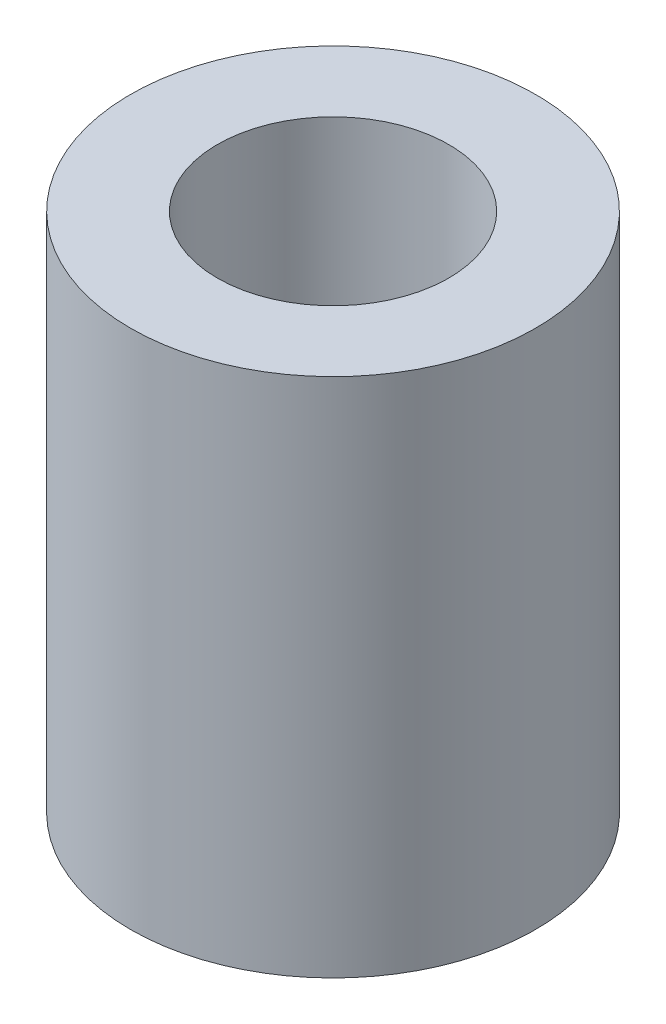
ISO-10303-21;
HEADER;
FILE_DESCRIPTION(('STEP AP214'),'2;1');
FILE_NAME('part.step','',(''),(''),'','','');
FILE_SCHEMA(('AUTOMOTIVE_DESIGN { 1 0 10303 214 1 1 1 1 }'));
ENDSEC;
DATA;
#1=APPLICATION_CONTEXT('core data for automotive mechanical design processes');
#2=APPLICATION_PROTOCOL_DEFINITION('international standard','automotive_design',2000,#1);
#3=PRODUCT_CONTEXT('',#1,'mechanical');
#4=PRODUCT('Part','Part','',(#3));
#5=PRODUCT_RELATED_PRODUCT_CATEGORY('part','',(#4));
#6=PRODUCT_DEFINITION_FORMATION('','',#4);
#7=PRODUCT_DEFINITION_CONTEXT('part definition',#1,'design');
#8=PRODUCT_DEFINITION('design','',#6,#7);
#9=PRODUCT_DEFINITION_SHAPE('','',#8);
#10=(LENGTH_UNIT() NAMED_UNIT(*) SI_UNIT(.MILLI.,.METRE.));
#11=(NAMED_UNIT(*) PLANE_ANGLE_UNIT() SI_UNIT($,.RADIAN.));
#12=(NAMED_UNIT(*) SI_UNIT($,.STERADIAN.) SOLID_ANGLE_UNIT());
#13=UNCERTAINTY_MEASURE_WITH_UNIT(LENGTH_MEASURE(1.E-05),#10,'distance_accuracy_value','');
#14=(GEOMETRIC_REPRESENTATION_CONTEXT(3) GLOBAL_UNCERTAINTY_ASSIGNED_CONTEXT((#13)) GLOBAL_UNIT_ASSIGNED_CONTEXT((#10,
#11,#12)) REPRESENTATION_CONTEXT('',''));
#15=CARTESIAN_POINT('',(0.,0.,0.));
#16=DIRECTION('',(0.,0.,1.));
#17=DIRECTION('',(1.,0.,0.));
#18=AXIS2_PLACEMENT_3D('',#15,#16,#17);
#19=CARTESIAN_POINT('',(0.,11.43,0.));
#20=DIRECTION('',(0.,1.,0.));
#21=DIRECTION('',(0.,0.,1.));
#22=AXIS2_PLACEMENT_3D('',#19,#20,#21);
#23=PLANE('',#22);
#24=CARTESIAN_POINT('',(0.,11.43,0.));
#25=DIRECTION('',(0.,1.,0.));
#26=DIRECTION('',(0.,0.,1.));
#27=AXIS2_PLACEMENT_3D('',#24,#25,#26);
#28=CIRCLE('',#27,4.445);
#29=CARTESIAN_POINT('',(0.,11.43,4.445));
#30=VERTEX_POINT('',#29);
#31=EDGE_CURVE('E10',#30,#30,#28,.T.);
#32=ORIENTED_EDGE('',*,*,#31,.T.);
#33=EDGE_LOOP('',(#32));
#34=FACE_BOUND('',#33,.T.);
#35=CARTESIAN_POINT('',(0.,11.43,0.));
#36=DIRECTION('',(0.,1.,0.));
#37=DIRECTION('',(0.,0.,1.));
#38=AXIS2_PLACEMENT_3D('',#35,#36,#37);
#39=CIRCLE('',#38,2.54);
#40=CARTESIAN_POINT('',(0.,11.43,2.54));
#41=VERTEX_POINT('',#40);
#42=EDGE_CURVE('E41',#41,#41,#39,.T.);
#43=ORIENTED_EDGE('',*,*,#42,.F.);
#44=EDGE_LOOP('',(#43));
#45=FACE_BOUND('',#44,.T.);
#46=ADVANCED_FACE('F30',(#34,#45),#23,.T.);
#47=CARTESIAN_POINT('',(0.,0.,0.));
#48=DIRECTION('',(0.,1.,0.));
#49=DIRECTION('',(0.,0.,1.));
#50=AXIS2_PLACEMENT_3D('',#47,#48,#49);
#51=PLANE('',#50);
#52=CARTESIAN_POINT('',(0.,0.,0.));
#53=DIRECTION('',(0.,1.,0.));
#54=DIRECTION('',(0.,0.,1.));
#55=AXIS2_PLACEMENT_3D('',#52,#53,#54);
#56=CIRCLE('',#55,4.445);
#57=CARTESIAN_POINT('',(0.,0.,4.445));
#58=VERTEX_POINT('',#57);
#59=EDGE_CURVE('E34',#58,#58,#56,.T.);
#60=ORIENTED_EDGE('',*,*,#59,.F.);
#61=EDGE_LOOP('',(#60));
#62=FACE_BOUND('',#61,.T.);
#63=CARTESIAN_POINT('',(0.,0.,0.));
#64=DIRECTION('',(0.,1.,0.));
#65=DIRECTION('',(0.,0.,1.));
#66=AXIS2_PLACEMENT_3D('',#63,#64,#65);
#67=CIRCLE('',#66,2.54);
#68=CARTESIAN_POINT('',(0.,0.,2.54));
#69=VERTEX_POINT('',#68);
#70=EDGE_CURVE('E43',#69,#69,#67,.T.);
#71=ORIENTED_EDGE('',*,*,#70,.T.);
#72=EDGE_LOOP('',(#71));
#73=FACE_BOUND('',#72,.T.);
#74=ADVANCED_FACE('F53',(#62,#73),#51,.F.);
#75=CARTESIAN_POINT('',(0.,11.43,0.));
#76=DIRECTION('',(0.,-1.,0.));
#77=DIRECTION('',(0.,0.,-1.));
#78=AXIS2_PLACEMENT_3D('',#75,#76,#77);
#79=CYLINDRICAL_SURFACE('',#78,4.445);
#80=ORIENTED_EDGE('',*,*,#31,.F.);
#81=EDGE_LOOP('',(#80));
#82=FACE_BOUND('',#81,.T.);
#83=ORIENTED_EDGE('',*,*,#59,.T.);
#84=EDGE_LOOP('',(#83));
#85=FACE_BOUND('',#84,.T.);
#86=ADVANCED_FACE('F32',(#82,#85),#79,.T.);
#87=CARTESIAN_POINT('',(0.,11.43,0.));
#88=DIRECTION('',(0.,-1.,0.));
#89=DIRECTION('',(0.,0.,-1.));
#90=AXIS2_PLACEMENT_3D('',#87,#88,#89);
#91=CYLINDRICAL_SURFACE('',#90,2.54);
#92=ORIENTED_EDGE('',*,*,#42,.T.);
#93=EDGE_LOOP('',(#92));
#94=FACE_BOUND('',#93,.T.);
#95=ORIENTED_EDGE('',*,*,#70,.F.);
#96=EDGE_LOOP('',(#95));
#97=FACE_BOUND('',#96,.T.);
#98=ADVANCED_FACE('F49',(#94,#97),#91,.F.);
#99=CLOSED_SHELL('',(#46,#74,#86,#98));
#100=MANIFOLD_SOLID_BREP('B2',#99);
#101=ADVANCED_BREP_SHAPE_REPRESENTATION('',(#18,#100),#14);
#102=SHAPE_DEFINITION_REPRESENTATION(#9,#101);
ENDSEC;
END-ISO-10303-21;
